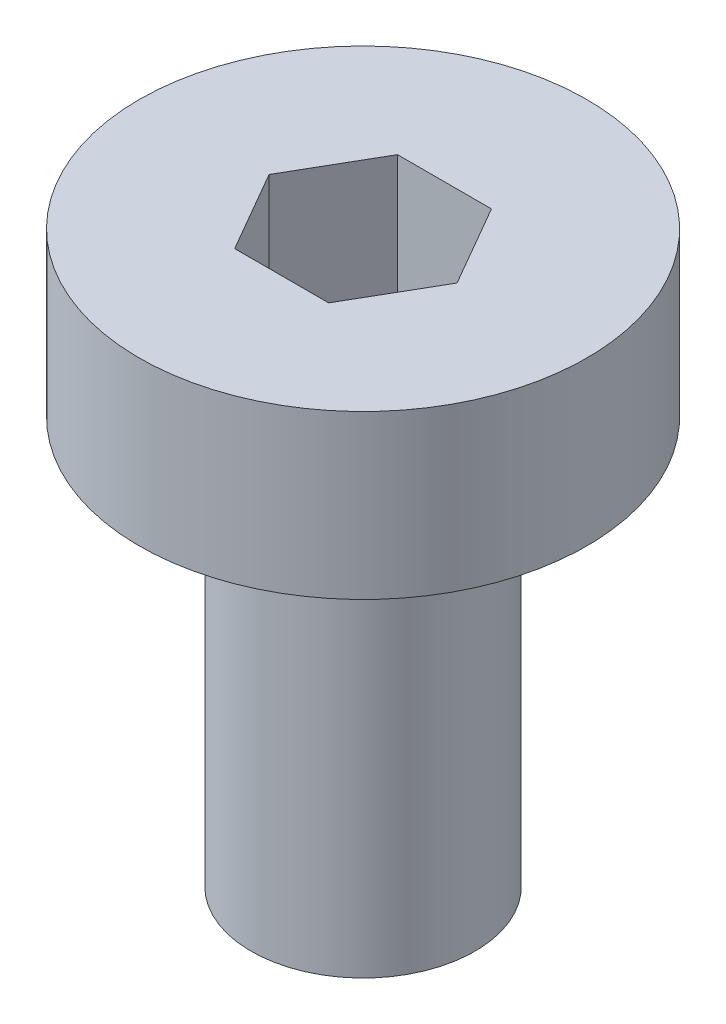
ISO-10303-21;
HEADER;
FILE_DESCRIPTION(('STEP AP214'),'2;1');
FILE_NAME('part.step','',(''),(''),'','','');
FILE_SCHEMA(('AUTOMOTIVE_DESIGN { 1 0 10303 214 1 1 1 1 }'));
ENDSEC;
DATA;
#1=APPLICATION_CONTEXT('core data for automotive mechanical design processes');
#2=APPLICATION_PROTOCOL_DEFINITION('international standard','automotive_design',2000,#1);
#3=PRODUCT_CONTEXT('',#1,'mechanical');
#4=PRODUCT('Part','Part','',(#3));
#5=PRODUCT_RELATED_PRODUCT_CATEGORY('part','',(#4));
#6=PRODUCT_DEFINITION_FORMATION('','',#4);
#7=PRODUCT_DEFINITION_CONTEXT('part definition',#1,'design');
#8=PRODUCT_DEFINITION('design','',#6,#7);
#9=PRODUCT_DEFINITION_SHAPE('','',#8);
#10=(LENGTH_UNIT() NAMED_UNIT(*) SI_UNIT(.MILLI.,.METRE.));
#11=(NAMED_UNIT(*) PLANE_ANGLE_UNIT() SI_UNIT($,.RADIAN.));
#12=(NAMED_UNIT(*) SI_UNIT($,.STERADIAN.) SOLID_ANGLE_UNIT());
#13=UNCERTAINTY_MEASURE_WITH_UNIT(LENGTH_MEASURE(1.E-05),#10,'distance_accuracy_value','');
#14=(GEOMETRIC_REPRESENTATION_CONTEXT(3) GLOBAL_UNCERTAINTY_ASSIGNED_CONTEXT((#13)) GLOBAL_UNIT_ASSIGNED_CONTEXT((#10,
#11,#12)) REPRESENTATION_CONTEXT('',''));
#15=CARTESIAN_POINT('',(0.,0.,0.));
#16=DIRECTION('',(0.,0.,1.));
#17=DIRECTION('',(1.,0.,0.));
#18=AXIS2_PLACEMENT_3D('',#15,#16,#17);
#19=CARTESIAN_POINT('',(0.,2.,0.));
#20=DIRECTION('',(0.,1.,0.));
#21=DIRECTION('',(-1.,0.,0.));
#22=AXIS2_PLACEMENT_3D('',#19,#20,#21);
#23=PLANE('',#22);
#24=DIRECTION('',(1.,0.,0.));
#25=VECTOR('',#24,1.);
#26=CARTESIAN_POINT('',(-0.577350269189625,2.,1.));
#27=LINE('',#26,#25);
#28=CARTESIAN_POINT('',(-0.577350269189625,2.,1.));
#29=VERTEX_POINT('',#28);
#30=CARTESIAN_POINT('',(0.577350269189626,2.,1.));
#31=VERTEX_POINT('',#30);
#32=EDGE_CURVE('E47',#29,#31,#27,.T.);
#33=ORIENTED_EDGE('',*,*,#32,.F.);
#34=DIRECTION('',(0.5,0.,0.866025403784439));
#35=VECTOR('',#34,1.);
#36=CARTESIAN_POINT('',(-1.15470053837925,2.,0.));
#37=LINE('',#36,#35);
#38=CARTESIAN_POINT('',(-1.15470053837925,2.,0.));
#39=VERTEX_POINT('',#38);
#40=EDGE_CURVE('E130',#39,#29,#37,.T.);
#41=ORIENTED_EDGE('',*,*,#40,.F.);
#42=DIRECTION('',(-0.5,0.,0.866025403784439));
#43=VECTOR('',#42,1.);
#44=CARTESIAN_POINT('',(-0.577350269189626,2.,-1.));
#45=LINE('',#44,#43);
#46=CARTESIAN_POINT('',(-0.577350269189626,2.,-1.));
#47=VERTEX_POINT('',#46);
#48=EDGE_CURVE('E128',#47,#39,#45,.T.);
#49=ORIENTED_EDGE('',*,*,#48,.F.);
#50=DIRECTION('',(-1.,0.,0.));
#51=VECTOR('',#50,1.);
#52=CARTESIAN_POINT('',(0.577350269189626,2.,-1.));
#53=LINE('',#52,#51);
#54=CARTESIAN_POINT('',(0.577350269189626,2.,-1.));
#55=VERTEX_POINT('',#54);
#56=EDGE_CURVE('E95',#55,#47,#53,.T.);
#57=ORIENTED_EDGE('',*,*,#56,.F.);
#58=DIRECTION('',(-0.5,0.,-0.866025403784438));
#59=VECTOR('',#58,1.);
#60=CARTESIAN_POINT('',(1.15470053837925,2.,0.));
#61=LINE('',#60,#59);
#62=CARTESIAN_POINT('',(1.15470053837925,2.,0.));
#63=VERTEX_POINT('',#62);
#64=EDGE_CURVE('E124',#63,#55,#61,.T.);
#65=ORIENTED_EDGE('',*,*,#64,.F.);
#66=DIRECTION('',(0.5,0.,-0.866025403784439));
#67=VECTOR('',#66,1.);
#68=CARTESIAN_POINT('',(0.577350269189626,2.,1.));
#69=LINE('',#68,#67);
#70=EDGE_CURVE('E121',#31,#63,#69,.T.);
#71=ORIENTED_EDGE('',*,*,#70,.F.);
#72=EDGE_LOOP('',(#33,#41,#49,#57,#65,#71));
#73=FACE_BOUND('',#72,.T.);
#74=CARTESIAN_POINT('',(0.,2.,0.));
#75=DIRECTION('',(0.,1.,0.));
#76=DIRECTION('',(-1.,0.,0.));
#77=AXIS2_PLACEMENT_3D('',#74,#75,#76);
#78=CIRCLE('',#77,2.75);
#79=CARTESIAN_POINT('',(-2.75,2.,0.));
#80=VERTEX_POINT('',#79);
#81=EDGE_CURVE('E11',#80,#80,#78,.T.);
#82=ORIENTED_EDGE('',*,*,#81,.T.);
#83=EDGE_LOOP('',(#82));
#84=FACE_BOUND('',#83,.T.);
#85=ADVANCED_FACE('F33',(#73,#84),#23,.T.);
#86=CARTESIAN_POINT('',(0.,-5.,0.));
#87=DIRECTION('',(0.,1.,0.));
#88=DIRECTION('',(-1.,0.,0.));
#89=AXIS2_PLACEMENT_3D('',#86,#87,#88);
#90=CYLINDRICAL_SURFACE('',#89,2.75);
#91=CARTESIAN_POINT('',(0.,0.,0.));
#92=DIRECTION('',(0.,1.,0.));
#93=DIRECTION('',(-1.,0.,0.));
#94=AXIS2_PLACEMENT_3D('',#91,#92,#93);
#95=CIRCLE('',#94,2.75);
#96=CARTESIAN_POINT('',(-2.75,0.,0.));
#97=VERTEX_POINT('',#96);
#98=EDGE_CURVE('E40',#97,#97,#95,.T.);
#99=ORIENTED_EDGE('',*,*,#98,.T.);
#100=EDGE_LOOP('',(#99));
#101=FACE_BOUND('',#100,.T.);
#102=ORIENTED_EDGE('',*,*,#81,.F.);
#103=EDGE_LOOP('',(#102));
#104=FACE_BOUND('',#103,.T.);
#105=ADVANCED_FACE('F147',(#101,#104),#90,.T.);
#106=CARTESIAN_POINT('',(-2.75,0.,0.));
#107=DIRECTION('',(0.,-1.,0.));
#108=DIRECTION('',(1.,0.,0.));
#109=AXIS2_PLACEMENT_3D('',#106,#107,#108);
#110=PLANE('',#109);
#111=CARTESIAN_POINT('',(0.,0.,0.));
#112=DIRECTION('',(0.,1.,0.));
#113=DIRECTION('',(-1.,0.,0.));
#114=AXIS2_PLACEMENT_3D('',#111,#112,#113);
#115=CIRCLE('',#114,1.375);
#116=CARTESIAN_POINT('',(-1.375,0.,0.));
#117=VERTEX_POINT('',#116);
#118=EDGE_CURVE('E142',#117,#117,#115,.T.);
#119=ORIENTED_EDGE('',*,*,#118,.T.);
#120=EDGE_LOOP('',(#119));
#121=FACE_BOUND('',#120,.T.);
#122=ORIENTED_EDGE('',*,*,#98,.F.);
#123=EDGE_LOOP('',(#122));
#124=FACE_BOUND('',#123,.T.);
#125=ADVANCED_FACE('F150',(#121,#124),#110,.T.);
#126=CARTESIAN_POINT('',(0.,-5.,0.));
#127=DIRECTION('',(0.,1.,0.));
#128=DIRECTION('',(-1.,0.,0.));
#129=AXIS2_PLACEMENT_3D('',#126,#127,#128);
#130=CYLINDRICAL_SURFACE('',#129,1.375);
#131=CARTESIAN_POINT('',(0.,-5.,0.));
#132=DIRECTION('',(0.,1.,0.));
#133=DIRECTION('',(-1.,0.,0.));
#134=AXIS2_PLACEMENT_3D('',#131,#132,#133);
#135=CIRCLE('',#134,1.375);
#136=CARTESIAN_POINT('',(-1.375,-5.,0.));
#137=VERTEX_POINT('',#136);
#138=EDGE_CURVE('E134',#137,#137,#135,.T.);
#139=ORIENTED_EDGE('',*,*,#138,.T.);
#140=EDGE_LOOP('',(#139));
#141=FACE_BOUND('',#140,.T.);
#142=ORIENTED_EDGE('',*,*,#118,.F.);
#143=EDGE_LOOP('',(#142));
#144=FACE_BOUND('',#143,.T.);
#145=ADVANCED_FACE('F152',(#141,#144),#130,.T.);
#146=CARTESIAN_POINT('',(-1.375,-5.,0.));
#147=DIRECTION('',(0.,-1.,0.));
#148=DIRECTION('',(1.,0.,0.));
#149=AXIS2_PLACEMENT_3D('',#146,#147,#148);
#150=PLANE('',#149);
#151=ORIENTED_EDGE('',*,*,#138,.F.);
#152=EDGE_LOOP('',(#151));
#153=FACE_BOUND('',#152,.T.);
#154=ADVANCED_FACE('F159',(#153),#150,.T.);
#155=CARTESIAN_POINT('',(-0.577350269189625,0.5,1.));
#156=DIRECTION('',(0.,0.,1.));
#157=DIRECTION('',(1.,0.,0.));
#158=AXIS2_PLACEMENT_3D('',#155,#156,#157);
#159=PLANE('',#158);
#160=ORIENTED_EDGE('',*,*,#32,.T.);
#161=DIRECTION('',(0.,1.,0.));
#162=VECTOR('',#161,1.);
#163=CARTESIAN_POINT('',(0.577350269189626,0.5,1.));
#164=LINE('',#163,#162);
#165=CARTESIAN_POINT('',(0.577350269189626,0.5,1.));
#166=VERTEX_POINT('',#165);
#167=EDGE_CURVE('E77',#166,#31,#164,.T.);
#168=ORIENTED_EDGE('',*,*,#167,.F.);
#169=DIRECTION('',(1.,0.,0.));
#170=VECTOR('',#169,1.);
#171=CARTESIAN_POINT('',(-0.577350269189625,0.5,1.));
#172=LINE('',#171,#170);
#173=CARTESIAN_POINT('',(-0.577350269189625,0.5,1.));
#174=VERTEX_POINT('',#173);
#175=EDGE_CURVE('E132',#174,#166,#172,.T.);
#176=ORIENTED_EDGE('',*,*,#175,.F.);
#177=DIRECTION('',(0.,1.,0.));
#178=VECTOR('',#177,1.);
#179=CARTESIAN_POINT('',(-0.577350269189625,0.5,1.));
#180=LINE('',#179,#178);
#181=EDGE_CURVE('E55',#174,#29,#180,.T.);
#182=ORIENTED_EDGE('',*,*,#181,.T.);
#183=EDGE_LOOP('',(#160,#168,#176,#182));
#184=FACE_BOUND('',#183,.T.);
#185=ADVANCED_FACE('F174',(#184),#159,.F.);
#186=CARTESIAN_POINT('',(-1.15470053837925,0.5,0.));
#187=DIRECTION('',(-0.866025403784438,0.,0.5));
#188=DIRECTION('',(0.5,0.,0.866025403784439));
#189=AXIS2_PLACEMENT_3D('',#186,#187,#188);
#190=PLANE('',#189);
#191=ORIENTED_EDGE('',*,*,#40,.T.);
#192=ORIENTED_EDGE('',*,*,#181,.F.);
#193=DIRECTION('',(0.5,0.,0.866025403784439));
#194=VECTOR('',#193,1.);
#195=CARTESIAN_POINT('',(-1.15470053837925,0.5,0.));
#196=LINE('',#195,#194);
#197=CARTESIAN_POINT('',(-1.15470053837925,0.5,0.));
#198=VERTEX_POINT('',#197);
#199=EDGE_CURVE('E107',#198,#174,#196,.T.);
#200=ORIENTED_EDGE('',*,*,#199,.F.);
#201=DIRECTION('',(0.,1.,0.));
#202=VECTOR('',#201,1.);
#203=CARTESIAN_POINT('',(-1.15470053837925,0.5,0.));
#204=LINE('',#203,#202);
#205=EDGE_CURVE('E99',#198,#39,#204,.T.);
#206=ORIENTED_EDGE('',*,*,#205,.T.);
#207=EDGE_LOOP('',(#191,#192,#200,#206));
#208=FACE_BOUND('',#207,.T.);
#209=ADVANCED_FACE('F176',(#208),#190,.F.);
#210=CARTESIAN_POINT('',(-0.577350269189626,0.5,-1.));
#211=DIRECTION('',(-0.866025403784439,0.,-0.5));
#212=DIRECTION('',(-0.5,0.,0.866025403784439));
#213=AXIS2_PLACEMENT_3D('',#210,#211,#212);
#214=PLANE('',#213);
#215=ORIENTED_EDGE('',*,*,#48,.T.);
#216=ORIENTED_EDGE('',*,*,#205,.F.);
#217=DIRECTION('',(-0.5,0.,0.866025403784439));
#218=VECTOR('',#217,1.);
#219=CARTESIAN_POINT('',(-0.577350269189626,0.5,-1.));
#220=LINE('',#219,#218);
#221=CARTESIAN_POINT('',(-0.577350269189626,0.5,-1.));
#222=VERTEX_POINT('',#221);
#223=EDGE_CURVE('E103',#222,#198,#220,.T.);
#224=ORIENTED_EDGE('',*,*,#223,.F.);
#225=DIRECTION('',(0.,1.,0.));
#226=VECTOR('',#225,1.);
#227=CARTESIAN_POINT('',(-0.577350269189626,0.5,-1.));
#228=LINE('',#227,#226);
#229=EDGE_CURVE('E88',#222,#47,#228,.T.);
#230=ORIENTED_EDGE('',*,*,#229,.T.);
#231=EDGE_LOOP('',(#215,#216,#224,#230));
#232=FACE_BOUND('',#231,.T.);
#233=ADVANCED_FACE('F104',(#232),#214,.F.);
#234=CARTESIAN_POINT('',(0.577350269189626,0.5,-1.));
#235=DIRECTION('',(0.,0.,-1.));
#236=DIRECTION('',(-1.,0.,0.));
#237=AXIS2_PLACEMENT_3D('',#234,#235,#236);
#238=PLANE('',#237);
#239=ORIENTED_EDGE('',*,*,#56,.T.);
#240=ORIENTED_EDGE('',*,*,#229,.F.);
#241=DIRECTION('',(-1.,0.,0.));
#242=VECTOR('',#241,1.);
#243=CARTESIAN_POINT('',(0.577350269189626,0.5,-1.));
#244=LINE('',#243,#242);
#245=CARTESIAN_POINT('',(0.577350269189626,0.5,-1.));
#246=VERTEX_POINT('',#245);
#247=EDGE_CURVE('E92',#246,#222,#244,.T.);
#248=ORIENTED_EDGE('',*,*,#247,.F.);
#249=DIRECTION('',(0.,1.,0.));
#250=VECTOR('',#249,1.);
#251=CARTESIAN_POINT('',(0.577350269189626,0.5,-1.));
#252=LINE('',#251,#250);
#253=EDGE_CURVE('E100',#246,#55,#252,.T.);
#254=ORIENTED_EDGE('',*,*,#253,.T.);
#255=EDGE_LOOP('',(#239,#240,#248,#254));
#256=FACE_BOUND('',#255,.T.);
#257=ADVANCED_FACE('F90',(#256),#238,.F.);
#258=CARTESIAN_POINT('',(1.15470053837925,0.5,0.));
#259=DIRECTION('',(0.866025403784439,0.,-0.5));
#260=DIRECTION('',(-0.5,0.,-0.866025403784439));
#261=AXIS2_PLACEMENT_3D('',#258,#259,#260);
#262=PLANE('',#261);
#263=ORIENTED_EDGE('',*,*,#64,.T.);
#264=ORIENTED_EDGE('',*,*,#253,.F.);
#265=DIRECTION('',(-0.5,0.,-0.866025403784438));
#266=VECTOR('',#265,1.);
#267=CARTESIAN_POINT('',(1.15470053837925,0.5,0.));
#268=LINE('',#267,#266);
#269=CARTESIAN_POINT('',(1.15470053837925,0.5,0.));
#270=VERTEX_POINT('',#269);
#271=EDGE_CURVE('E113',#270,#246,#268,.T.);
#272=ORIENTED_EDGE('',*,*,#271,.F.);
#273=DIRECTION('',(0.,1.,0.));
#274=VECTOR('',#273,1.);
#275=CARTESIAN_POINT('',(1.15470053837925,0.5,0.));
#276=LINE('',#275,#274);
#277=EDGE_CURVE('E137',#270,#63,#276,.T.);
#278=ORIENTED_EDGE('',*,*,#277,.T.);
#279=EDGE_LOOP('',(#263,#264,#272,#278));
#280=FACE_BOUND('',#279,.T.);
#281=ADVANCED_FACE('F188',(#280),#262,.F.);
#282=CARTESIAN_POINT('',(0.577350269189626,0.5,1.));
#283=DIRECTION('',(0.866025403784439,0.,0.5));
#284=DIRECTION('',(0.5,0.,-0.866025403784439));
#285=AXIS2_PLACEMENT_3D('',#282,#283,#284);
#286=PLANE('',#285);
#287=ORIENTED_EDGE('',*,*,#70,.T.);
#288=ORIENTED_EDGE('',*,*,#277,.F.);
#289=DIRECTION('',(0.5,0.,-0.866025403784439));
#290=VECTOR('',#289,1.);
#291=CARTESIAN_POINT('',(0.577350269189626,0.5,1.));
#292=LINE('',#291,#290);
#293=EDGE_CURVE('E115',#166,#270,#292,.T.);
#294=ORIENTED_EDGE('',*,*,#293,.F.);
#295=ORIENTED_EDGE('',*,*,#167,.T.);
#296=EDGE_LOOP('',(#287,#288,#294,#295));
#297=FACE_BOUND('',#296,.T.);
#298=ADVANCED_FACE('F172',(#297),#286,.F.);
#299=CARTESIAN_POINT('',(0.,0.5,0.));
#300=DIRECTION('',(0.,1.,0.));
#301=DIRECTION('',(0.,0.,1.));
#302=AXIS2_PLACEMENT_3D('',#299,#300,#301);
#303=PLANE('',#302);
#304=ORIENTED_EDGE('',*,*,#175,.T.);
#305=ORIENTED_EDGE('',*,*,#293,.T.);
#306=ORIENTED_EDGE('',*,*,#271,.T.);
#307=ORIENTED_EDGE('',*,*,#247,.T.);
#308=ORIENTED_EDGE('',*,*,#223,.T.);
#309=ORIENTED_EDGE('',*,*,#199,.T.);
#310=EDGE_LOOP('',(#304,#305,#306,#307,#308,#309));
#311=FACE_BOUND('',#310,.T.);
#312=ADVANCED_FACE('F110',(#311),#303,.T.);
#313=CLOSED_SHELL('',(#85,#105,#125,#145,#154,#185,#209,#233,#257,#281,#298,#312));
#314=MANIFOLD_SOLID_BREP('B2',#313);
#315=ADVANCED_BREP_SHAPE_REPRESENTATION('',(#18,#314),#14);
#316=SHAPE_DEFINITION_REPRESENTATION(#9,#315);
ENDSEC;
END-ISO-10303-21;
